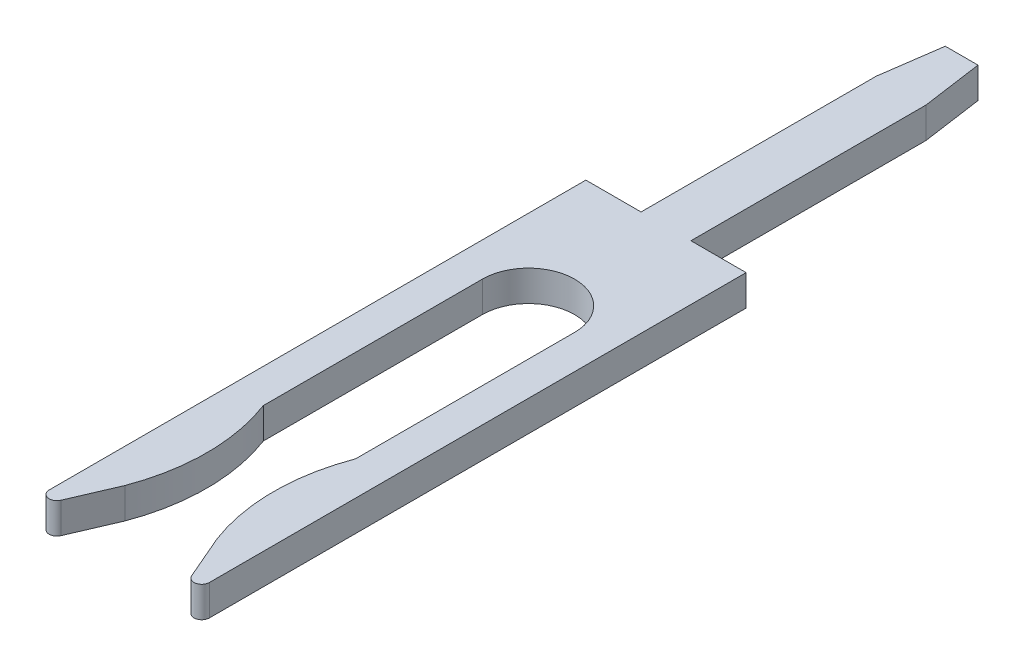
ISO-10303-21;
HEADER;
FILE_DESCRIPTION(('STEP AP214'),'2;1');
FILE_NAME('part.step','',(''),(''),'','','');
FILE_SCHEMA(('AUTOMOTIVE_DESIGN { 1 0 10303 214 1 1 1 1 }'));
ENDSEC;
DATA;
#1=APPLICATION_CONTEXT('core data for automotive mechanical design processes');
#2=APPLICATION_PROTOCOL_DEFINITION('international standard','automotive_design',2000,#1);
#3=PRODUCT_CONTEXT('',#1,'mechanical');
#4=PRODUCT('Part','Part','',(#3));
#5=PRODUCT_RELATED_PRODUCT_CATEGORY('part','',(#4));
#6=PRODUCT_DEFINITION_FORMATION('','',#4);
#7=PRODUCT_DEFINITION_CONTEXT('part definition',#1,'design');
#8=PRODUCT_DEFINITION('design','',#6,#7);
#9=PRODUCT_DEFINITION_SHAPE('','',#8);
#10=(LENGTH_UNIT() NAMED_UNIT(*) SI_UNIT(.MILLI.,.METRE.));
#11=(NAMED_UNIT(*) PLANE_ANGLE_UNIT() SI_UNIT($,.RADIAN.));
#12=(NAMED_UNIT(*) SI_UNIT($,.STERADIAN.) SOLID_ANGLE_UNIT());
#13=UNCERTAINTY_MEASURE_WITH_UNIT(LENGTH_MEASURE(1.E-05),#10,'distance_accuracy_value','');
#14=(GEOMETRIC_REPRESENTATION_CONTEXT(3) GLOBAL_UNCERTAINTY_ASSIGNED_CONTEXT((#13)) GLOBAL_UNIT_ASSIGNED_CONTEXT((#10,
#11,#12)) REPRESENTATION_CONTEXT('',''));
#15=CARTESIAN_POINT('',(0.,0.,0.));
#16=DIRECTION('',(0.,0.,1.));
#17=DIRECTION('',(1.,0.,0.));
#18=AXIS2_PLACEMENT_3D('',#15,#16,#17);
#19=CARTESIAN_POINT('',(0.,-0.2,0.284306438184069));
#20=DIRECTION('',(0.,1.,0.));
#21=DIRECTION('',(1.,0.,0.));
#22=AXIS2_PLACEMENT_3D('',#19,#20,#21);
#23=PLANE('',#22);
#24=DIRECTION('',(1.,0.,0.));
#25=VECTOR('',#24,1.);
#26=CARTESIAN_POINT('',(0.324469626937749,-0.2,0.888283848762512));
#27=LINE('',#26,#25);
#28=CARTESIAN_POINT('',(0.324469626937749,-0.2,0.888283848762512));
#29=VERTEX_POINT('',#28);
#30=CARTESIAN_POINT('',(1.04280345814228,-0.2,0.888283848762512));
#31=VERTEX_POINT('',#30);
#32=EDGE_CURVE('E11',#29,#31,#27,.T.);
#33=ORIENTED_EDGE('',*,*,#32,.T.);
#34=DIRECTION('',(0.,0.,1.));
#35=VECTOR('',#34,1.);
#36=CARTESIAN_POINT('',(1.04280345814228,-0.2,0.888283848762512));
#37=LINE('',#36,#35);
#38=CARTESIAN_POINT('',(1.04280345814228,-0.2,7.87327103255999));
#39=VERTEX_POINT('',#38);
#40=EDGE_CURVE('E301',#31,#39,#37,.T.);
#41=ORIENTED_EDGE('',*,*,#40,.T.);
#42=CARTESIAN_POINT('',(0.942803458142281,-0.2,7.87327103255999));
#43=DIRECTION('',(0.,1.,0.));
#44=DIRECTION('',(1.,0.,0.));
#45=AXIS2_PLACEMENT_3D('',#42,#43,#44);
#46=CIRCLE('',#45,0.100000000000002);
#47=CARTESIAN_POINT('',(0.850958820007972,-0.2,7.91282558281629));
#48=VERTEX_POINT('',#47);
#49=EDGE_CURVE('E324',#48,#39,#46,.T.);
#50=ORIENTED_EDGE('',*,*,#49,.F.);
#51=DIRECTION('',(-0.395545502562964,0.,-0.918446381343088));
#52=VECTOR('',#51,1.);
#53=CARTESIAN_POINT('',(0.850958820007972,-0.2,7.91282558281629));
#54=LINE('',#53,#52);
#55=CARTESIAN_POINT('',(0.600313171744347,-0.2,7.33083289890131));
#56=VERTEX_POINT('',#55);
#57=EDGE_CURVE('E266',#48,#56,#54,.T.);
#58=ORIENTED_EDGE('',*,*,#57,.T.);
#59=CARTESIAN_POINT('',(2.98279491669871,-0.2,6.42995974435727));
#60=DIRECTION('',(0.,1.,0.));
#61=DIRECTION('',(1.,0.,0.));
#62=AXIS2_PLACEMENT_3D('',#59,#60,#61);
#63=CIRCLE('',#62,2.54711438801223);
#64=CARTESIAN_POINT('',(0.600313171744347,-0.2,5.52908658981323));
#65=VERTEX_POINT('',#64);
#66=EDGE_CURVE('E226',#65,#56,#63,.T.);
#67=ORIENTED_EDGE('',*,*,#66,.F.);
#68=DIRECTION('',(0.,0.,-1.));
#69=VECTOR('',#68,1.);
#70=CARTESIAN_POINT('',(0.600313171744347,-0.2,5.52908658981323));
#71=LINE('',#70,#69);
#72=CARTESIAN_POINT('',(0.600313171744347,-0.2,2.67766647040844));
#73=VERTEX_POINT('',#72);
#74=EDGE_CURVE('E232',#65,#73,#71,.T.);
#75=ORIENTED_EDGE('',*,*,#74,.T.);
#76=CARTESIAN_POINT('',(0.,-0.2,2.67766647040844));
#77=DIRECTION('',(0.,1.,0.));
#78=DIRECTION('',(1.,0.,0.));
#79=AXIS2_PLACEMENT_3D('',#76,#77,#78);
#80=CIRCLE('',#79,0.600313171744347);
#81=CARTESIAN_POINT('',(-0.60031317174435,-0.2,2.67766647040844));
#82=VERTEX_POINT('',#81);
#83=EDGE_CURVE('E336',#73,#82,#80,.T.);
#84=ORIENTED_EDGE('',*,*,#83,.T.);
#85=DIRECTION('',(0.,0.,1.));
#86=VECTOR('',#85,1.);
#87=CARTESIAN_POINT('',(-0.600313171744347,-0.2,2.67766647040844));
#88=LINE('',#87,#86);
#89=CARTESIAN_POINT('',(-0.600313171744347,-0.2,5.52908658981323));
#90=VERTEX_POINT('',#89);
#91=EDGE_CURVE('E155',#82,#90,#88,.T.);
#92=ORIENTED_EDGE('',*,*,#91,.T.);
#93=CARTESIAN_POINT('',(-2.98279491669871,-0.2,6.42995974435727));
#94=DIRECTION('',(0.,1.,0.));
#95=DIRECTION('',(1.,0.,0.));
#96=AXIS2_PLACEMENT_3D('',#93,#94,#95);
#97=CIRCLE('',#96,2.54711438801223);
#98=CARTESIAN_POINT('',(-0.600313171744347,-0.2,7.33083289890131));
#99=VERTEX_POINT('',#98);
#100=EDGE_CURVE('E278',#99,#90,#97,.T.);
#101=ORIENTED_EDGE('',*,*,#100,.F.);
#102=DIRECTION('',(-0.395545502562964,0.,0.918446381343088));
#103=VECTOR('',#102,1.);
#104=CARTESIAN_POINT('',(-0.600313171744347,-0.2,7.33083289890131));
#105=LINE('',#104,#103);
#106=CARTESIAN_POINT('',(-0.850958820007972,-0.2,7.91282558281629));
#107=VERTEX_POINT('',#106);
#108=EDGE_CURVE('E245',#99,#107,#105,.T.);
#109=ORIENTED_EDGE('',*,*,#108,.T.);
#110=CARTESIAN_POINT('',(-0.942803458142281,-0.2,7.87327103255999));
#111=DIRECTION('',(0.,1.,0.));
#112=DIRECTION('',(1.,0.,0.));
#113=AXIS2_PLACEMENT_3D('',#110,#111,#112);
#114=CIRCLE('',#113,0.1);
#115=CARTESIAN_POINT('',(-1.04280345814228,-0.2,7.87327103255999));
#116=VERTEX_POINT('',#115);
#117=EDGE_CURVE('E258',#116,#107,#114,.T.);
#118=ORIENTED_EDGE('',*,*,#117,.F.);
#119=DIRECTION('',(0.,0.,-1.));
#120=VECTOR('',#119,1.);
#121=CARTESIAN_POINT('',(-1.04280345814228,-0.2,7.87327103255999));
#122=LINE('',#121,#120);
#123=CARTESIAN_POINT('',(-1.04280345814228,-0.2,0.888283848762512));
#124=VERTEX_POINT('',#123);
#125=EDGE_CURVE('E238',#116,#124,#122,.T.);
#126=ORIENTED_EDGE('',*,*,#125,.T.);
#127=DIRECTION('',(1.,0.,0.));
#128=VECTOR('',#127,1.);
#129=CARTESIAN_POINT('',(-1.04280345814228,-0.2,0.888283848762512));
#130=LINE('',#129,#128);
#131=CARTESIAN_POINT('',(-0.324469626937749,-0.2,0.888283848762512));
#132=VERTEX_POINT('',#131);
#133=EDGE_CURVE('E300',#124,#132,#130,.T.);
#134=ORIENTED_EDGE('',*,*,#133,.T.);
#135=DIRECTION('',(0.,0.,-1.));
#136=VECTOR('',#135,1.);
#137=CARTESIAN_POINT('',(-0.324469626937749,-0.2,0.888283848762512));
#138=LINE('',#137,#136);
#139=CARTESIAN_POINT('',(-0.324469626937749,-0.2,-2.17138586723707));
#140=VERTEX_POINT('',#139);
#141=EDGE_CURVE('E210',#132,#140,#138,.T.);
#142=ORIENTED_EDGE('',*,*,#141,.T.);
#143=DIRECTION('',(0.140037219771041,0.,-0.990146240248781));
#144=VECTOR('',#143,1.);
#145=CARTESIAN_POINT('',(-0.324469626937749,-0.2,-2.17138586723707));
#146=LINE('',#145,#144);
#147=CARTESIAN_POINT('',(-0.213,-0.2,-2.9595422744751));
#148=VERTEX_POINT('',#147);
#149=EDGE_CURVE('E21',#140,#148,#146,.T.);
#150=ORIENTED_EDGE('',*,*,#149,.T.);
#151=DIRECTION('',(1.,0.,0.));
#152=VECTOR('',#151,1.);
#153=CARTESIAN_POINT('',(-0.213,-0.2,-2.9595422744751));
#154=LINE('',#153,#152);
#155=CARTESIAN_POINT('',(0.213,-0.2,-2.9595422744751));
#156=VERTEX_POINT('',#155);
#157=EDGE_CURVE('E200',#148,#156,#154,.T.);
#158=ORIENTED_EDGE('',*,*,#157,.T.);
#159=DIRECTION('',(0.140037219771041,0.,0.990146240248781));
#160=VECTOR('',#159,1.);
#161=CARTESIAN_POINT('',(0.213,-0.2,-2.9595422744751));
#162=LINE('',#161,#160);
#163=CARTESIAN_POINT('',(0.324469626937749,-0.2,-2.17138586723707));
#164=VERTEX_POINT('',#163);
#165=EDGE_CURVE('E272',#156,#164,#162,.T.);
#166=ORIENTED_EDGE('',*,*,#165,.T.);
#167=DIRECTION('',(0.,0.,1.));
#168=VECTOR('',#167,1.);
#169=CARTESIAN_POINT('',(0.324469626937749,-0.2,-9.67138586723707));
#170=LINE('',#169,#168);
#171=EDGE_CURVE('E246',#164,#29,#170,.T.);
#172=ORIENTED_EDGE('',*,*,#171,.T.);
#173=EDGE_LOOP('',(#33,#41,#50,#58,#67,#75,#84,#92,#101,#109,#118,#126,#134,#142,#150,#158,#166,#172));
#174=FACE_BOUND('',#173,.T.);
#175=ADVANCED_FACE('F17',(#174),#23,.F.);
#176=CARTESIAN_POINT('',(0.,0.2,0.284306438184069));
#177=DIRECTION('',(0.,1.,0.));
#178=DIRECTION('',(1.,0.,0.));
#179=AXIS2_PLACEMENT_3D('',#176,#177,#178);
#180=PLANE('',#179);
#181=DIRECTION('',(0.,0.,1.));
#182=VECTOR('',#181,1.);
#183=CARTESIAN_POINT('',(1.04280345814228,0.2,0.888283848762512));
#184=LINE('',#183,#182);
#185=CARTESIAN_POINT('',(1.04280345814228,0.2,0.888283848762512));
#186=VERTEX_POINT('',#185);
#187=CARTESIAN_POINT('',(1.04280345814228,0.2,7.87327103255999));
#188=VERTEX_POINT('',#187);
#189=EDGE_CURVE('E289',#186,#188,#184,.T.);
#190=ORIENTED_EDGE('',*,*,#189,.F.);
#191=DIRECTION('',(1.,0.,0.));
#192=VECTOR('',#191,1.);
#193=CARTESIAN_POINT('',(0.324469626937749,0.2,0.888283848762512));
#194=LINE('',#193,#192);
#195=CARTESIAN_POINT('',(0.324469626937749,0.2,0.888283848762512));
#196=VERTEX_POINT('',#195);
#197=EDGE_CURVE('E28',#196,#186,#194,.T.);
#198=ORIENTED_EDGE('',*,*,#197,.F.);
#199=DIRECTION('',(0.,0.,1.));
#200=VECTOR('',#199,1.);
#201=CARTESIAN_POINT('',(0.324469626937749,0.2,-9.67138586723707));
#202=LINE('',#201,#200);
#203=CARTESIAN_POINT('',(0.324469626937749,0.2,-2.17138586723707));
#204=VERTEX_POINT('',#203);
#205=EDGE_CURVE('E276',#204,#196,#202,.T.);
#206=ORIENTED_EDGE('',*,*,#205,.F.);
#207=DIRECTION('',(0.140037219771041,0.,0.990146240248781));
#208=VECTOR('',#207,1.);
#209=CARTESIAN_POINT('',(0.213,0.2,-2.9595422744751));
#210=LINE('',#209,#208);
#211=CARTESIAN_POINT('',(0.213,0.2,-2.9595422744751));
#212=VERTEX_POINT('',#211);
#213=EDGE_CURVE('E189',#212,#204,#210,.T.);
#214=ORIENTED_EDGE('',*,*,#213,.F.);
#215=DIRECTION('',(1.,0.,0.));
#216=VECTOR('',#215,1.);
#217=CARTESIAN_POINT('',(-0.213,0.2,-2.9595422744751));
#218=LINE('',#217,#216);
#219=CARTESIAN_POINT('',(-0.213,0.2,-2.9595422744751));
#220=VERTEX_POINT('',#219);
#221=EDGE_CURVE('E181',#220,#212,#218,.T.);
#222=ORIENTED_EDGE('',*,*,#221,.F.);
#223=DIRECTION('',(0.140037219771041,0.,-0.990146240248781));
#224=VECTOR('',#223,1.);
#225=CARTESIAN_POINT('',(-0.324469626937749,0.2,-2.17138586723707));
#226=LINE('',#225,#224);
#227=CARTESIAN_POINT('',(-0.324469626937749,0.2,-2.17138586723707));
#228=VERTEX_POINT('',#227);
#229=EDGE_CURVE('E186',#228,#220,#226,.T.);
#230=ORIENTED_EDGE('',*,*,#229,.F.);
#231=DIRECTION('',(0.,0.,-1.));
#232=VECTOR('',#231,1.);
#233=CARTESIAN_POINT('',(-0.324469626937749,0.2,0.888283848762512));
#234=LINE('',#233,#232);
#235=CARTESIAN_POINT('',(-0.324469626937749,0.2,0.888283848762512));
#236=VERTEX_POINT('',#235);
#237=EDGE_CURVE('E297',#236,#228,#234,.T.);
#238=ORIENTED_EDGE('',*,*,#237,.F.);
#239=DIRECTION('',(1.,0.,0.));
#240=VECTOR('',#239,1.);
#241=CARTESIAN_POINT('',(-1.04280345814228,0.2,0.888283848762512));
#242=LINE('',#241,#240);
#243=CARTESIAN_POINT('',(-1.04280345814228,0.2,0.888283848762512));
#244=VERTEX_POINT('',#243);
#245=EDGE_CURVE('E357',#244,#236,#242,.T.);
#246=ORIENTED_EDGE('',*,*,#245,.F.);
#247=DIRECTION('',(0.,0.,-1.));
#248=VECTOR('',#247,1.);
#249=CARTESIAN_POINT('',(-1.04280345814228,0.2,7.87327103255999));
#250=LINE('',#249,#248);
#251=CARTESIAN_POINT('',(-1.04280345814228,0.2,7.87327103255999));
#252=VERTEX_POINT('',#251);
#253=EDGE_CURVE('E239',#252,#244,#250,.T.);
#254=ORIENTED_EDGE('',*,*,#253,.F.);
#255=CARTESIAN_POINT('',(-0.942803458142281,0.2,7.87327103255999));
#256=DIRECTION('',(0.,-1.,0.));
#257=DIRECTION('',(1.,0.,0.));
#258=AXIS2_PLACEMENT_3D('',#255,#256,#257);
#259=CIRCLE('',#258,0.1);
#260=CARTESIAN_POINT('',(-0.850958820007972,0.2,7.91282558281629));
#261=VERTEX_POINT('',#260);
#262=EDGE_CURVE('E240',#261,#252,#259,.T.);
#263=ORIENTED_EDGE('',*,*,#262,.F.);
#264=DIRECTION('',(-0.395545502562964,0.,0.918446381343088));
#265=VECTOR('',#264,1.);
#266=CARTESIAN_POINT('',(-0.600313171744347,0.2,7.33083289890131));
#267=LINE('',#266,#265);
#268=CARTESIAN_POINT('',(-0.600313171744347,0.2,7.33083289890131));
#269=VERTEX_POINT('',#268);
#270=EDGE_CURVE('E281',#269,#261,#267,.T.);
#271=ORIENTED_EDGE('',*,*,#270,.F.);
#272=CARTESIAN_POINT('',(-2.98279491669871,0.2,6.42995974435727));
#273=DIRECTION('',(0.,-1.,0.));
#274=DIRECTION('',(1.,0.,0.));
#275=AXIS2_PLACEMENT_3D('',#272,#273,#274);
#276=CIRCLE('',#275,2.54711438801223);
#277=CARTESIAN_POINT('',(-0.600313171744347,0.2,5.52908658981323));
#278=VERTEX_POINT('',#277);
#279=EDGE_CURVE('E250',#278,#269,#276,.T.);
#280=ORIENTED_EDGE('',*,*,#279,.F.);
#281=DIRECTION('',(0.,0.,1.));
#282=VECTOR('',#281,1.);
#283=CARTESIAN_POINT('',(-0.600313171744347,0.2,2.67766647040844));
#284=LINE('',#283,#282);
#285=CARTESIAN_POINT('',(-0.60031317174435,0.2,2.67766647040844));
#286=VERTEX_POINT('',#285);
#287=EDGE_CURVE('E144',#286,#278,#284,.T.);
#288=ORIENTED_EDGE('',*,*,#287,.F.);
#289=CARTESIAN_POINT('',(0.,0.2,2.67766647040844));
#290=DIRECTION('',(0.,1.,0.));
#291=DIRECTION('',(1.,0.,0.));
#292=AXIS2_PLACEMENT_3D('',#289,#290,#291);
#293=CIRCLE('',#292,0.600313171744347);
#294=CARTESIAN_POINT('',(0.600313171744347,0.2,2.67766647040844));
#295=VERTEX_POINT('',#294);
#296=EDGE_CURVE('E262',#295,#286,#293,.T.);
#297=ORIENTED_EDGE('',*,*,#296,.F.);
#298=DIRECTION('',(0.,0.,-1.));
#299=VECTOR('',#298,1.);
#300=CARTESIAN_POINT('',(0.600313171744347,0.2,5.52908658981323));
#301=LINE('',#300,#299);
#302=CARTESIAN_POINT('',(0.600313171744347,0.2,5.52908658981323));
#303=VERTEX_POINT('',#302);
#304=EDGE_CURVE('E233',#303,#295,#301,.T.);
#305=ORIENTED_EDGE('',*,*,#304,.F.);
#306=CARTESIAN_POINT('',(2.98279491669871,0.2,6.42995974435727));
#307=DIRECTION('',(0.,-1.,0.));
#308=DIRECTION('',(1.,0.,0.));
#309=AXIS2_PLACEMENT_3D('',#306,#307,#308);
#310=CIRCLE('',#309,2.54711438801223);
#311=CARTESIAN_POINT('',(0.600313171744347,0.2,7.33083289890131));
#312=VERTEX_POINT('',#311);
#313=EDGE_CURVE('E227',#312,#303,#310,.T.);
#314=ORIENTED_EDGE('',*,*,#313,.F.);
#315=DIRECTION('',(-0.395545502562964,0.,-0.918446381343088));
#316=VECTOR('',#315,1.);
#317=CARTESIAN_POINT('',(0.850958820007972,0.2,7.91282558281629));
#318=LINE('',#317,#316);
#319=CARTESIAN_POINT('',(0.850958820007972,0.2,7.91282558281629));
#320=VERTEX_POINT('',#319);
#321=EDGE_CURVE('E271',#320,#312,#318,.T.);
#322=ORIENTED_EDGE('',*,*,#321,.F.);
#323=CARTESIAN_POINT('',(0.942803458142281,0.2,7.87327103255999));
#324=DIRECTION('',(0.,-1.,0.));
#325=DIRECTION('',(1.,0.,0.));
#326=AXIS2_PLACEMENT_3D('',#323,#324,#325);
#327=CIRCLE('',#326,0.100000000000002);
#328=EDGE_CURVE('E305',#188,#320,#327,.T.);
#329=ORIENTED_EDGE('',*,*,#328,.F.);
#330=EDGE_LOOP('',(#190,#198,#206,#214,#222,#230,#238,#246,#254,#263,#271,#280,#288,#297,#305,
#314,#322,#329));
#331=FACE_BOUND('',#330,.T.);
#332=ADVANCED_FACE('F184',(#331),#180,.T.);
#333=CARTESIAN_POINT('',(0.683636542540015,-0.2,0.888283848762512));
#334=DIRECTION('',(0.,0.,-1.));
#335=DIRECTION('',(0.,-1.,0.));
#336=AXIS2_PLACEMENT_3D('',#333,#334,#335);
#337=PLANE('',#336);
#338=ORIENTED_EDGE('',*,*,#197,.T.);
#339=DIRECTION('',(0.,1.,0.));
#340=VECTOR('',#339,1.);
#341=CARTESIAN_POINT('',(1.04280345814228,-0.2,0.888283848762512));
#342=LINE('',#341,#340);
#343=EDGE_CURVE('E220',#31,#186,#342,.T.);
#344=ORIENTED_EDGE('',*,*,#343,.F.);
#345=ORIENTED_EDGE('',*,*,#32,.F.);
#346=DIRECTION('',(0.,1.,0.));
#347=VECTOR('',#346,1.);
#348=CARTESIAN_POINT('',(0.324469626937749,-0.2,0.888283848762512));
#349=LINE('',#348,#347);
#350=EDGE_CURVE('E249',#29,#196,#349,.T.);
#351=ORIENTED_EDGE('',*,*,#350,.T.);
#352=EDGE_LOOP('',(#338,#344,#345,#351));
#353=FACE_BOUND('',#352,.T.);
#354=ADVANCED_FACE('F19',(#353),#337,.T.);
#355=CARTESIAN_POINT('',(0.324469626937749,-0.2,-4.39155100923728));
#356=DIRECTION('',(1.,0.,0.));
#357=DIRECTION('',(0.,1.,0.));
#358=AXIS2_PLACEMENT_3D('',#355,#356,#357);
#359=PLANE('',#358);
#360=ORIENTED_EDGE('',*,*,#205,.T.);
#361=ORIENTED_EDGE('',*,*,#350,.F.);
#362=ORIENTED_EDGE('',*,*,#171,.F.);
#363=DIRECTION('',(0.,1.,0.));
#364=VECTOR('',#363,1.);
#365=CARTESIAN_POINT('',(0.324469626937749,-0.2,-2.17138586723707));
#366=LINE('',#365,#364);
#367=EDGE_CURVE('E277',#164,#204,#366,.T.);
#368=ORIENTED_EDGE('',*,*,#367,.T.);
#369=EDGE_LOOP('',(#360,#361,#362,#368));
#370=FACE_BOUND('',#369,.T.);
#371=ADVANCED_FACE('F475',(#370),#359,.T.);
#372=CARTESIAN_POINT('',(0.268734813468875,-0.2,-2.5654640708561));
#373=DIRECTION('',(0.990146240248781,0.,-0.140037219771041));
#374=DIRECTION('',(0.,-1.,0.));
#375=AXIS2_PLACEMENT_3D('',#372,#373,#374);
#376=PLANE('',#375);
#377=ORIENTED_EDGE('',*,*,#213,.T.);
#378=ORIENTED_EDGE('',*,*,#367,.F.);
#379=ORIENTED_EDGE('',*,*,#165,.F.);
#380=DIRECTION('',(0.,1.,0.));
#381=VECTOR('',#380,1.);
#382=CARTESIAN_POINT('',(0.213,-0.2,-2.9595422744751));
#383=LINE('',#382,#381);
#384=EDGE_CURVE('E194',#156,#212,#383,.T.);
#385=ORIENTED_EDGE('',*,*,#384,.T.);
#386=EDGE_LOOP('',(#377,#378,#379,#385));
#387=FACE_BOUND('',#386,.T.);
#388=ADVANCED_FACE('F478',(#387),#376,.T.);
#389=CARTESIAN_POINT('',(0.1065,-0.2,-2.9595422744751));
#390=DIRECTION('',(0.,0.,-1.));
#391=DIRECTION('',(0.,-1.,0.));
#392=AXIS2_PLACEMENT_3D('',#389,#390,#391);
#393=PLANE('',#392);
#394=ORIENTED_EDGE('',*,*,#221,.T.);
#395=ORIENTED_EDGE('',*,*,#384,.F.);
#396=ORIENTED_EDGE('',*,*,#157,.F.);
#397=DIRECTION('',(0.,1.,0.));
#398=VECTOR('',#397,1.);
#399=CARTESIAN_POINT('',(-0.213,-0.2,-2.9595422744751));
#400=LINE('',#399,#398);
#401=EDGE_CURVE('E197',#148,#220,#400,.T.);
#402=ORIENTED_EDGE('',*,*,#401,.T.);
#403=EDGE_LOOP('',(#394,#395,#396,#402));
#404=FACE_BOUND('',#403,.T.);
#405=ADVANCED_FACE('F198',(#404),#393,.T.);
#406=CARTESIAN_POINT('',(-0.268734813468875,-0.2,-2.5654640708561));
#407=DIRECTION('',(-0.990146240248781,0.,-0.140037219771041));
#408=DIRECTION('',(-0.140037219771041,0.,0.990146240248781));
#409=AXIS2_PLACEMENT_3D('',#406,#407,#408);
#410=PLANE('',#409);
#411=ORIENTED_EDGE('',*,*,#229,.T.);
#412=ORIENTED_EDGE('',*,*,#401,.F.);
#413=ORIENTED_EDGE('',*,*,#149,.F.);
#414=DIRECTION('',(0.,1.,0.));
#415=VECTOR('',#414,1.);
#416=CARTESIAN_POINT('',(-0.324469626937749,-0.2,-2.17138586723707));
#417=LINE('',#416,#415);
#418=EDGE_CURVE('E207',#140,#228,#417,.T.);
#419=ORIENTED_EDGE('',*,*,#418,.T.);
#420=EDGE_LOOP('',(#411,#412,#413,#419));
#421=FACE_BOUND('',#420,.T.);
#422=ADVANCED_FACE('F205',(#421),#410,.T.);
#423=CARTESIAN_POINT('',(-0.324469626937749,-0.2,-4.39155100923728));
#424=DIRECTION('',(-1.,0.,0.));
#425=DIRECTION('',(0.,0.,1.));
#426=AXIS2_PLACEMENT_3D('',#423,#424,#425);
#427=PLANE('',#426);
#428=ORIENTED_EDGE('',*,*,#237,.T.);
#429=ORIENTED_EDGE('',*,*,#418,.F.);
#430=ORIENTED_EDGE('',*,*,#141,.F.);
#431=DIRECTION('',(0.,1.,0.));
#432=VECTOR('',#431,1.);
#433=CARTESIAN_POINT('',(-0.324469626937749,-0.2,0.888283848762512));
#434=LINE('',#433,#432);
#435=EDGE_CURVE('E360',#132,#236,#434,.T.);
#436=ORIENTED_EDGE('',*,*,#435,.T.);
#437=EDGE_LOOP('',(#428,#429,#430,#436));
#438=FACE_BOUND('',#437,.T.);
#439=ADVANCED_FACE('F648',(#438),#427,.T.);
#440=CARTESIAN_POINT('',(-0.683636542540015,-0.2,0.888283848762512));
#441=DIRECTION('',(0.,0.,-1.));
#442=DIRECTION('',(0.,-1.,0.));
#443=AXIS2_PLACEMENT_3D('',#440,#441,#442);
#444=PLANE('',#443);
#445=ORIENTED_EDGE('',*,*,#245,.T.);
#446=ORIENTED_EDGE('',*,*,#435,.F.);
#447=ORIENTED_EDGE('',*,*,#133,.F.);
#448=DIRECTION('',(0.,1.,0.));
#449=VECTOR('',#448,1.);
#450=CARTESIAN_POINT('',(-1.04280345814228,-0.2,0.888283848762512));
#451=LINE('',#450,#449);
#452=EDGE_CURVE('E234',#124,#244,#451,.T.);
#453=ORIENTED_EDGE('',*,*,#452,.T.);
#454=EDGE_LOOP('',(#445,#446,#447,#453));
#455=FACE_BOUND('',#454,.T.);
#456=ADVANCED_FACE('F434',(#455),#444,.T.);
#457=CARTESIAN_POINT('',(-1.04280345814228,-0.2,4.38077744066125));
#458=DIRECTION('',(-1.,0.,0.));
#459=DIRECTION('',(0.,0.,1.));
#460=AXIS2_PLACEMENT_3D('',#457,#458,#459);
#461=PLANE('',#460);
#462=ORIENTED_EDGE('',*,*,#253,.T.);
#463=ORIENTED_EDGE('',*,*,#452,.F.);
#464=ORIENTED_EDGE('',*,*,#125,.F.);
#465=DIRECTION('',(0.,1.,0.));
#466=VECTOR('',#465,1.);
#467=CARTESIAN_POINT('',(-1.04280345814228,-0.2,7.87327103255999));
#468=LINE('',#467,#466);
#469=EDGE_CURVE('E244',#116,#252,#468,.T.);
#470=ORIENTED_EDGE('',*,*,#469,.T.);
#471=EDGE_LOOP('',(#462,#463,#464,#470));
#472=FACE_BOUND('',#471,.T.);
#473=ADVANCED_FACE('F385',(#472),#461,.T.);
#474=CARTESIAN_POINT('',(-0.942803458142281,-0.2,7.87327103255999));
#475=DIRECTION('',(0.,1.,0.));
#476=DIRECTION('',(1.,0.,0.));
#477=AXIS2_PLACEMENT_3D('',#474,#475,#476);
#478=CYLINDRICAL_SURFACE('',#477,0.1);
#479=ORIENTED_EDGE('',*,*,#262,.T.);
#480=ORIENTED_EDGE('',*,*,#469,.F.);
#481=ORIENTED_EDGE('',*,*,#117,.T.);
#482=DIRECTION('',(0.,1.,0.));
#483=VECTOR('',#482,1.);
#484=CARTESIAN_POINT('',(-0.850958820007972,-0.2,7.91282558281629));
#485=LINE('',#484,#483);
#486=EDGE_CURVE('E313',#107,#261,#485,.T.);
#487=ORIENTED_EDGE('',*,*,#486,.T.);
#488=EDGE_LOOP('',(#479,#480,#481,#487));
#489=FACE_BOUND('',#488,.T.);
#490=ADVANCED_FACE('F694',(#489),#478,.T.);
#491=CARTESIAN_POINT('',(-0.72563599587616,-0.2,7.6218292408588));
#492=DIRECTION('',(0.918446381343088,0.,0.395545502562964));
#493=DIRECTION('',(0.,-1.,0.));
#494=AXIS2_PLACEMENT_3D('',#491,#492,#493);
#495=PLANE('',#494);
#496=ORIENTED_EDGE('',*,*,#270,.T.);
#497=ORIENTED_EDGE('',*,*,#486,.F.);
#498=ORIENTED_EDGE('',*,*,#108,.F.);
#499=DIRECTION('',(0.,1.,0.));
#500=VECTOR('',#499,1.);
#501=CARTESIAN_POINT('',(-0.600313171744347,-0.2,7.33083289890131));
#502=LINE('',#501,#500);
#503=EDGE_CURVE('E254',#99,#269,#502,.T.);
#504=ORIENTED_EDGE('',*,*,#503,.T.);
#505=EDGE_LOOP('',(#496,#497,#498,#504));
#506=FACE_BOUND('',#505,.T.);
#507=ADVANCED_FACE('F657',(#506),#495,.T.);
#508=CARTESIAN_POINT('',(-2.98279491669871,-0.2,6.42995974435727));
#509=DIRECTION('',(0.,1.,0.));
#510=DIRECTION('',(1.,0.,0.));
#511=AXIS2_PLACEMENT_3D('',#508,#509,#510);
#512=CYLINDRICAL_SURFACE('',#511,2.54711438801223);
#513=ORIENTED_EDGE('',*,*,#279,.T.);
#514=ORIENTED_EDGE('',*,*,#503,.F.);
#515=ORIENTED_EDGE('',*,*,#100,.T.);
#516=DIRECTION('',(0.,1.,0.));
#517=VECTOR('',#516,1.);
#518=CARTESIAN_POINT('',(-0.600313171744347,-0.2,5.52908658981323));
#519=LINE('',#518,#517);
#520=EDGE_CURVE('E296',#90,#278,#519,.T.);
#521=ORIENTED_EDGE('',*,*,#520,.T.);
#522=EDGE_LOOP('',(#513,#514,#515,#521));
#523=FACE_BOUND('',#522,.T.);
#524=ADVANCED_FACE('F653',(#523),#512,.T.);
#525=CARTESIAN_POINT('',(-0.600313171744347,-0.2,4.10337653011083));
#526=DIRECTION('',(1.,0.,0.));
#527=DIRECTION('',(0.,1.,0.));
#528=AXIS2_PLACEMENT_3D('',#525,#526,#527);
#529=PLANE('',#528);
#530=ORIENTED_EDGE('',*,*,#287,.T.);
#531=ORIENTED_EDGE('',*,*,#520,.F.);
#532=ORIENTED_EDGE('',*,*,#91,.F.);
#533=DIRECTION('',(0.,1.,0.));
#534=VECTOR('',#533,1.);
#535=CARTESIAN_POINT('',(-0.60031317174435,-0.2,2.67766647040844));
#536=LINE('',#535,#534);
#537=EDGE_CURVE('E288',#82,#286,#536,.T.);
#538=ORIENTED_EDGE('',*,*,#537,.T.);
#539=EDGE_LOOP('',(#530,#531,#532,#538));
#540=FACE_BOUND('',#539,.T.);
#541=ADVANCED_FACE('F446',(#540),#529,.T.);
#542=CARTESIAN_POINT('',(0.,-0.2,2.67766647040844));
#543=DIRECTION('',(0.,1.,0.));
#544=DIRECTION('',(1.,0.,0.));
#545=AXIS2_PLACEMENT_3D('',#542,#543,#544);
#546=CYLINDRICAL_SURFACE('',#545,0.60031317174435);
#547=ORIENTED_EDGE('',*,*,#296,.T.);
#548=ORIENTED_EDGE('',*,*,#537,.F.);
#549=ORIENTED_EDGE('',*,*,#83,.F.);
#550=DIRECTION('',(0.,1.,0.));
#551=VECTOR('',#550,1.);
#552=CARTESIAN_POINT('',(0.600313171744347,-0.2,2.67766647040844));
#553=LINE('',#552,#551);
#554=EDGE_CURVE('E228',#73,#295,#553,.T.);
#555=ORIENTED_EDGE('',*,*,#554,.T.);
#556=EDGE_LOOP('',(#547,#548,#549,#555));
#557=FACE_BOUND('',#556,.T.);
#558=ADVANCED_FACE('F448',(#557),#546,.F.);
#559=CARTESIAN_POINT('',(0.600313171744347,-0.2,4.10337653011083));
#560=DIRECTION('',(-1.,0.,0.));
#561=DIRECTION('',(0.,0.,1.));
#562=AXIS2_PLACEMENT_3D('',#559,#560,#561);
#563=PLANE('',#562);
#564=ORIENTED_EDGE('',*,*,#304,.T.);
#565=ORIENTED_EDGE('',*,*,#554,.F.);
#566=ORIENTED_EDGE('',*,*,#74,.F.);
#567=DIRECTION('',(0.,1.,0.));
#568=VECTOR('',#567,1.);
#569=CARTESIAN_POINT('',(0.600313171744347,-0.2,5.52908658981323));
#570=LINE('',#569,#568);
#571=EDGE_CURVE('E222',#65,#303,#570,.T.);
#572=ORIENTED_EDGE('',*,*,#571,.T.);
#573=EDGE_LOOP('',(#564,#565,#566,#572));
#574=FACE_BOUND('',#573,.T.);
#575=ADVANCED_FACE('F456',(#574),#563,.T.);
#576=CARTESIAN_POINT('',(2.98279491669871,-0.2,6.42995974435727));
#577=DIRECTION('',(0.,1.,0.));
#578=DIRECTION('',(-1.,0.,0.));
#579=AXIS2_PLACEMENT_3D('',#576,#577,#578);
#580=CYLINDRICAL_SURFACE('',#579,2.54711438801223);
#581=ORIENTED_EDGE('',*,*,#313,.T.);
#582=ORIENTED_EDGE('',*,*,#571,.F.);
#583=ORIENTED_EDGE('',*,*,#66,.T.);
#584=DIRECTION('',(0.,1.,0.));
#585=VECTOR('',#584,1.);
#586=CARTESIAN_POINT('',(0.600313171744347,-0.2,7.33083289890131));
#587=LINE('',#586,#585);
#588=EDGE_CURVE('E267',#56,#312,#587,.T.);
#589=ORIENTED_EDGE('',*,*,#588,.T.);
#590=EDGE_LOOP('',(#581,#582,#583,#589));
#591=FACE_BOUND('',#590,.T.);
#592=ADVANCED_FACE('F461',(#591),#580,.T.);
#593=CARTESIAN_POINT('',(0.725635995876159,-0.2,7.6218292408588));
#594=DIRECTION('',(-0.918446381343088,0.,0.395545502562964));
#595=DIRECTION('',(0.,1.,0.));
#596=AXIS2_PLACEMENT_3D('',#593,#594,#595);
#597=PLANE('',#596);
#598=ORIENTED_EDGE('',*,*,#321,.T.);
#599=ORIENTED_EDGE('',*,*,#588,.F.);
#600=ORIENTED_EDGE('',*,*,#57,.F.);
#601=DIRECTION('',(0.,1.,0.));
#602=VECTOR('',#601,1.);
#603=CARTESIAN_POINT('',(0.850958820007972,-0.2,7.91282558281629));
#604=LINE('',#603,#602);
#605=EDGE_CURVE('E309',#48,#320,#604,.T.);
#606=ORIENTED_EDGE('',*,*,#605,.T.);
#607=EDGE_LOOP('',(#598,#599,#600,#606));
#608=FACE_BOUND('',#607,.T.);
#609=ADVANCED_FACE('F465',(#608),#597,.T.);
#610=CARTESIAN_POINT('',(0.942803458142281,-0.2,7.87327103255999));
#611=DIRECTION('',(0.,1.,0.));
#612=DIRECTION('',(1.,0.,0.));
#613=AXIS2_PLACEMENT_3D('',#610,#611,#612);
#614=CYLINDRICAL_SURFACE('',#613,0.100000000000002);
#615=ORIENTED_EDGE('',*,*,#328,.T.);
#616=ORIENTED_EDGE('',*,*,#605,.F.);
#617=ORIENTED_EDGE('',*,*,#49,.T.);
#618=DIRECTION('',(0.,1.,0.));
#619=VECTOR('',#618,1.);
#620=CARTESIAN_POINT('',(1.04280345814228,-0.2,7.87327103255999));
#621=LINE('',#620,#619);
#622=EDGE_CURVE('E293',#39,#188,#621,.T.);
#623=ORIENTED_EDGE('',*,*,#622,.T.);
#624=EDGE_LOOP('',(#615,#616,#617,#623));
#625=FACE_BOUND('',#624,.T.);
#626=ADVANCED_FACE('F467',(#625),#614,.T.);
#627=CARTESIAN_POINT('',(1.04280345814228,-0.2,4.38077744066125));
#628=DIRECTION('',(1.,0.,0.));
#629=DIRECTION('',(0.,1.,0.));
#630=AXIS2_PLACEMENT_3D('',#627,#628,#629);
#631=PLANE('',#630);
#632=ORIENTED_EDGE('',*,*,#189,.T.);
#633=ORIENTED_EDGE('',*,*,#622,.F.);
#634=ORIENTED_EDGE('',*,*,#40,.F.);
#635=ORIENTED_EDGE('',*,*,#343,.T.);
#636=EDGE_LOOP('',(#632,#633,#634,#635));
#637=FACE_BOUND('',#636,.T.);
#638=ADVANCED_FACE('F472',(#637),#631,.T.);
#639=CLOSED_SHELL('',(#175,#332,#354,#371,#388,#405,#422,#439,#456,#473,#490,#507,#524,#541,
#558,#575,#592,#609,#626,#638));
#640=MANIFOLD_SOLID_BREP('B1',#639);
#641=ADVANCED_BREP_SHAPE_REPRESENTATION('',(#18,#640),#14);
#642=SHAPE_DEFINITION_REPRESENTATION(#9,#641);
ENDSEC;
END-ISO-10303-21;
